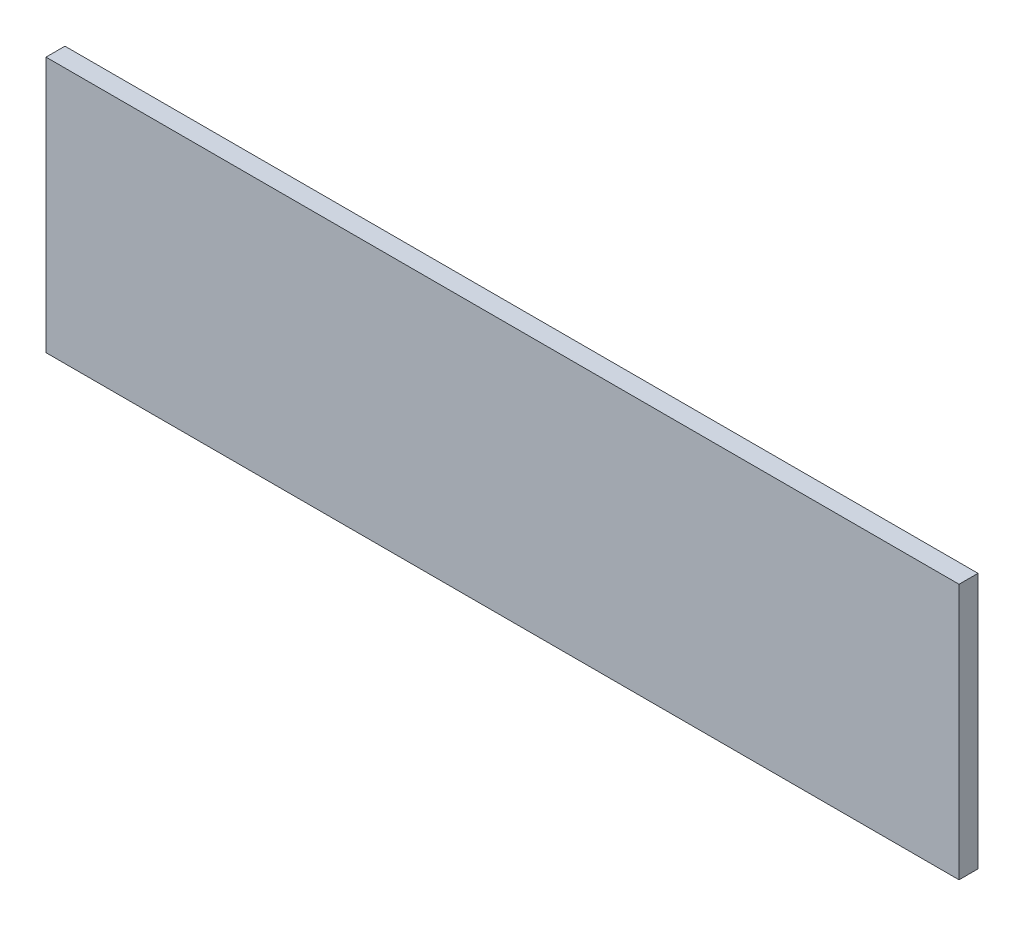
ISO-10303-21;
HEADER;
FILE_DESCRIPTION(('STEP AP214'),'2;1');
FILE_NAME('part.step','',(''),(''),'','','');
FILE_SCHEMA(('AUTOMOTIVE_DESIGN { 1 0 10303 214 1 1 1 1 }'));
ENDSEC;
DATA;
#1=APPLICATION_CONTEXT('core data for automotive mechanical design processes');
#2=APPLICATION_PROTOCOL_DEFINITION('international standard','automotive_design',2000,#1);
#3=PRODUCT_CONTEXT('',#1,'mechanical');
#4=PRODUCT('Part','Part','',(#3));
#5=PRODUCT_RELATED_PRODUCT_CATEGORY('part','',(#4));
#6=PRODUCT_DEFINITION_FORMATION('','',#4);
#7=PRODUCT_DEFINITION_CONTEXT('part definition',#1,'design');
#8=PRODUCT_DEFINITION('design','',#6,#7);
#9=PRODUCT_DEFINITION_SHAPE('','',#8);
#10=(LENGTH_UNIT() NAMED_UNIT(*) SI_UNIT(.MILLI.,.METRE.));
#11=(NAMED_UNIT(*) PLANE_ANGLE_UNIT() SI_UNIT($,.RADIAN.));
#12=(NAMED_UNIT(*) SI_UNIT($,.STERADIAN.) SOLID_ANGLE_UNIT());
#13=UNCERTAINTY_MEASURE_WITH_UNIT(LENGTH_MEASURE(1.E-05),#10,'distance_accuracy_value','');
#14=(GEOMETRIC_REPRESENTATION_CONTEXT(3) GLOBAL_UNCERTAINTY_ASSIGNED_CONTEXT((#13)) GLOBAL_UNIT_ASSIGNED_CONTEXT((#10,
#11,#12)) REPRESENTATION_CONTEXT('',''));
#15=CARTESIAN_POINT('',(0.,0.,0.));
#16=DIRECTION('',(0.,0.,1.));
#17=DIRECTION('',(1.,0.,0.));
#18=AXIS2_PLACEMENT_3D('',#15,#16,#17);
#19=CARTESIAN_POINT('',(0.,0.,3.3));
#20=DIRECTION('',(1.,0.,0.));
#21=DIRECTION('',(0.,0.,-1.));
#22=AXIS2_PLACEMENT_3D('',#19,#20,#21);
#23=PLANE('',#22);
#24=DIRECTION('',(0.,-1.,0.));
#25=VECTOR('',#24,1.);
#26=CARTESIAN_POINT('',(0.,0.,0.));
#27=LINE('',#26,#25);
#28=CARTESIAN_POINT('',(0.,44.58,0.));
#29=VERTEX_POINT('',#28);
#30=CARTESIAN_POINT('',(0.,0.,0.));
#31=VERTEX_POINT('',#30);
#32=EDGE_CURVE('E98',#29,#31,#27,.T.);
#33=ORIENTED_EDGE('',*,*,#32,.T.);
#34=DIRECTION('',(0.,0.,-1.));
#35=VECTOR('',#34,1.);
#36=CARTESIAN_POINT('',(0.,0.,3.3));
#37=LINE('',#36,#35);
#38=CARTESIAN_POINT('',(0.,0.,3.3));
#39=VERTEX_POINT('',#38);
#40=EDGE_CURVE('E11',#39,#31,#37,.T.);
#41=ORIENTED_EDGE('',*,*,#40,.F.);
#42=DIRECTION('',(0.,-1.,0.));
#43=VECTOR('',#42,1.);
#44=CARTESIAN_POINT('',(0.,0.,3.3));
#45=LINE('',#44,#43);
#46=CARTESIAN_POINT('',(0.,44.58,3.3));
#47=VERTEX_POINT('',#46);
#48=EDGE_CURVE('E86',#47,#39,#45,.T.);
#49=ORIENTED_EDGE('',*,*,#48,.F.);
#50=DIRECTION('',(0.,0.,-1.));
#51=VECTOR('',#50,1.);
#52=CARTESIAN_POINT('',(0.,44.58,3.3));
#53=LINE('',#52,#51);
#54=EDGE_CURVE('E94',#47,#29,#53,.T.);
#55=ORIENTED_EDGE('',*,*,#54,.T.);
#56=EDGE_LOOP('',(#33,#41,#49,#55));
#57=FACE_BOUND('',#56,.T.);
#58=ADVANCED_FACE('F35',(#57),#23,.F.);
#59=CARTESIAN_POINT('',(0.,0.,3.3));
#60=DIRECTION('',(0.,1.,0.));
#61=DIRECTION('',(0.,0.,1.));
#62=AXIS2_PLACEMENT_3D('',#59,#60,#61);
#63=PLANE('',#62);
#64=DIRECTION('',(1.,0.,0.));
#65=VECTOR('',#64,1.);
#66=CARTESIAN_POINT('',(0.,0.,0.));
#67=LINE('',#66,#65);
#68=CARTESIAN_POINT('',(159.,0.,0.));
#69=VERTEX_POINT('',#68);
#70=EDGE_CURVE('E90',#31,#69,#67,.T.);
#71=ORIENTED_EDGE('',*,*,#70,.T.);
#72=DIRECTION('',(0.,0.,-1.));
#73=VECTOR('',#72,1.);
#74=CARTESIAN_POINT('',(159.,0.,3.3));
#75=LINE('',#74,#73);
#76=CARTESIAN_POINT('',(159.,0.,3.3));
#77=VERTEX_POINT('',#76);
#78=EDGE_CURVE('E43',#77,#69,#75,.T.);
#79=ORIENTED_EDGE('',*,*,#78,.F.);
#80=DIRECTION('',(1.,0.,0.));
#81=VECTOR('',#80,1.);
#82=CARTESIAN_POINT('',(0.,0.,3.3));
#83=LINE('',#82,#81);
#84=EDGE_CURVE('E81',#39,#77,#83,.T.);
#85=ORIENTED_EDGE('',*,*,#84,.F.);
#86=ORIENTED_EDGE('',*,*,#40,.T.);
#87=EDGE_LOOP('',(#71,#79,#85,#86));
#88=FACE_BOUND('',#87,.T.);
#89=ADVANCED_FACE('F89',(#88),#63,.F.);
#90=CARTESIAN_POINT('',(159.,0.,3.3));
#91=DIRECTION('',(-1.,0.,0.));
#92=DIRECTION('',(0.,0.,1.));
#93=AXIS2_PLACEMENT_3D('',#90,#91,#92);
#94=PLANE('',#93);
#95=DIRECTION('',(0.,1.,0.));
#96=VECTOR('',#95,1.);
#97=CARTESIAN_POINT('',(159.,0.,0.));
#98=LINE('',#97,#96);
#99=CARTESIAN_POINT('',(159.,44.58,0.));
#100=VERTEX_POINT('',#99);
#101=EDGE_CURVE('E68',#69,#100,#98,.T.);
#102=ORIENTED_EDGE('',*,*,#101,.T.);
#103=DIRECTION('',(0.,0.,-1.));
#104=VECTOR('',#103,1.);
#105=CARTESIAN_POINT('',(159.,44.58,3.3));
#106=LINE('',#105,#104);
#107=CARTESIAN_POINT('',(159.,44.58,3.3));
#108=VERTEX_POINT('',#107);
#109=EDGE_CURVE('E91',#108,#100,#106,.T.);
#110=ORIENTED_EDGE('',*,*,#109,.F.);
#111=DIRECTION('',(0.,1.,0.));
#112=VECTOR('',#111,1.);
#113=CARTESIAN_POINT('',(159.,0.,3.3));
#114=LINE('',#113,#112);
#115=EDGE_CURVE('E84',#77,#108,#114,.T.);
#116=ORIENTED_EDGE('',*,*,#115,.F.);
#117=ORIENTED_EDGE('',*,*,#78,.T.);
#118=EDGE_LOOP('',(#102,#110,#116,#117));
#119=FACE_BOUND('',#118,.T.);
#120=ADVANCED_FACE('F92',(#119),#94,.F.);
#121=CARTESIAN_POINT('',(0.,44.58,3.3));
#122=DIRECTION('',(0.,-1.,0.));
#123=DIRECTION('',(0.,0.,-1.));
#124=AXIS2_PLACEMENT_3D('',#121,#122,#123);
#125=PLANE('',#124);
#126=DIRECTION('',(-1.,0.,0.));
#127=VECTOR('',#126,1.);
#128=CARTESIAN_POINT('',(0.,44.58,0.));
#129=LINE('',#128,#127);
#130=EDGE_CURVE('E74',#100,#29,#129,.T.);
#131=ORIENTED_EDGE('',*,*,#130,.T.);
#132=ORIENTED_EDGE('',*,*,#54,.F.);
#133=DIRECTION('',(-1.,0.,0.));
#134=VECTOR('',#133,1.);
#135=CARTESIAN_POINT('',(0.,44.58,3.3));
#136=LINE('',#135,#134);
#137=EDGE_CURVE('E51',#108,#47,#136,.T.);
#138=ORIENTED_EDGE('',*,*,#137,.F.);
#139=ORIENTED_EDGE('',*,*,#109,.T.);
#140=EDGE_LOOP('',(#131,#132,#138,#139));
#141=FACE_BOUND('',#140,.T.);
#142=ADVANCED_FACE('F105',(#141),#125,.F.);
#143=CARTESIAN_POINT('',(0.,0.,3.3));
#144=DIRECTION('',(0.,0.,-1.));
#145=DIRECTION('',(-1.,0.,0.));
#146=AXIS2_PLACEMENT_3D('',#143,#144,#145);
#147=PLANE('',#146);
#148=ORIENTED_EDGE('',*,*,#48,.T.);
#149=ORIENTED_EDGE('',*,*,#84,.T.);
#150=ORIENTED_EDGE('',*,*,#115,.T.);
#151=ORIENTED_EDGE('',*,*,#137,.T.);
#152=EDGE_LOOP('',(#148,#149,#150,#151));
#153=FACE_BOUND('',#152,.T.);
#154=ADVANCED_FACE('F82',(#153),#147,.F.);
#155=CARTESIAN_POINT('',(0.,0.,0.));
#156=DIRECTION('',(0.,0.,-1.));
#157=DIRECTION('',(-1.,0.,0.));
#158=AXIS2_PLACEMENT_3D('',#155,#156,#157);
#159=PLANE('',#158);
#160=ORIENTED_EDGE('',*,*,#32,.F.);
#161=ORIENTED_EDGE('',*,*,#130,.F.);
#162=ORIENTED_EDGE('',*,*,#101,.F.);
#163=ORIENTED_EDGE('',*,*,#70,.F.);
#164=EDGE_LOOP('',(#160,#161,#162,#163));
#165=FACE_BOUND('',#164,.T.);
#166=ADVANCED_FACE('F108',(#165),#159,.T.);
#167=CLOSED_SHELL('',(#58,#89,#120,#142,#154,#166));
#168=MANIFOLD_SOLID_BREP('B2',#167);
#169=ADVANCED_BREP_SHAPE_REPRESENTATION('',(#18,#168),#14);
#170=SHAPE_DEFINITION_REPRESENTATION(#9,#169);
ENDSEC;
END-ISO-10303-21;
